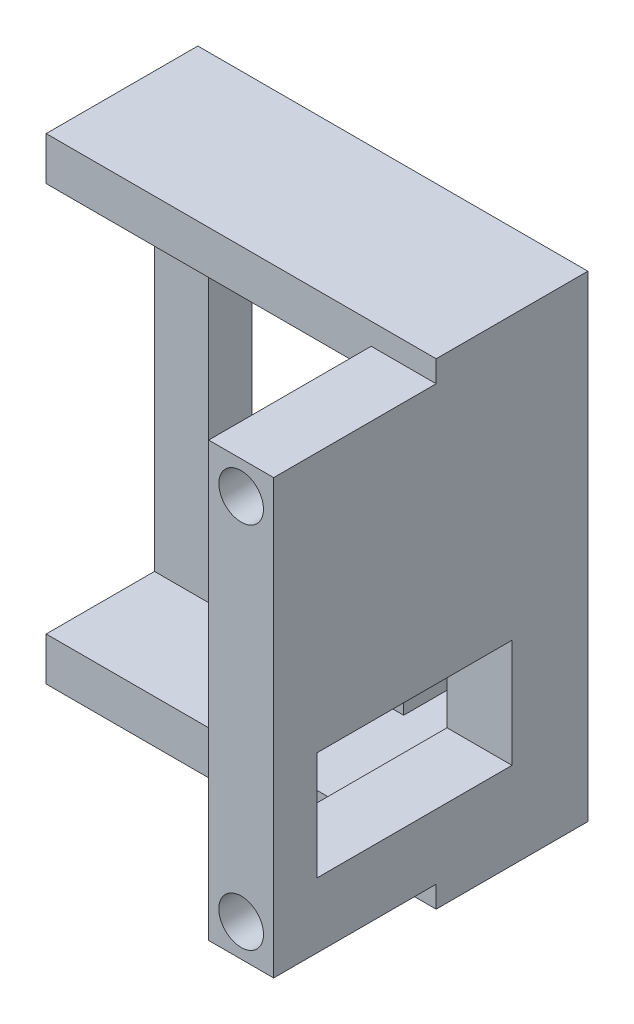
ISO-10303-21;
HEADER;
FILE_DESCRIPTION(('STEP AP214'),'2;1');
FILE_NAME('part.step','',(''),(''),'','','');
FILE_SCHEMA(('AUTOMOTIVE_DESIGN { 1 0 10303 214 1 1 1 1 }'));
ENDSEC;
DATA;
#1=APPLICATION_CONTEXT('core data for automotive mechanical design processes');
#2=APPLICATION_PROTOCOL_DEFINITION('international standard','automotive_design',2000,#1);
#3=PRODUCT_CONTEXT('',#1,'mechanical');
#4=PRODUCT('Part','Part','',(#3));
#5=PRODUCT_RELATED_PRODUCT_CATEGORY('part','',(#4));
#6=PRODUCT_DEFINITION_FORMATION('','',#4);
#7=PRODUCT_DEFINITION_CONTEXT('part definition',#1,'design');
#8=PRODUCT_DEFINITION('design','',#6,#7);
#9=PRODUCT_DEFINITION_SHAPE('','',#8);
#10=(LENGTH_UNIT() NAMED_UNIT(*) SI_UNIT(.MILLI.,.METRE.));
#11=(NAMED_UNIT(*) PLANE_ANGLE_UNIT() SI_UNIT($,.RADIAN.));
#12=(NAMED_UNIT(*) SI_UNIT($,.STERADIAN.) SOLID_ANGLE_UNIT());
#13=UNCERTAINTY_MEASURE_WITH_UNIT(LENGTH_MEASURE(1.E-05),#10,'distance_accuracy_value','');
#14=(GEOMETRIC_REPRESENTATION_CONTEXT(3) GLOBAL_UNCERTAINTY_ASSIGNED_CONTEXT((#13)) GLOBAL_UNIT_ASSIGNED_CONTEXT((#10,
#11,#12)) REPRESENTATION_CONTEXT('',''));
#15=CARTESIAN_POINT('',(0.,0.,0.));
#16=DIRECTION('',(0.,0.,1.));
#17=DIRECTION('',(1.,0.,0.));
#18=AXIS2_PLACEMENT_3D('',#15,#16,#17);
#19=CARTESIAN_POINT('',(-2.325,-15.4875,25.));
#20=DIRECTION('',(0.,1.,0.));
#21=DIRECTION('',(-1.,0.,0.));
#22=AXIS2_PLACEMENT_3D('',#19,#20,#21);
#23=PLANE('',#22);
#24=DIRECTION('',(-1.,0.,0.));
#25=VECTOR('',#24,1.);
#26=CARTESIAN_POINT('',(0.,-15.4875,10.));
#27=LINE('',#26,#25);
#28=CARTESIAN_POINT('',(3.675,-15.4875,10.));
#29=VERTEX_POINT('',#28);
#30=CARTESIAN_POINT('',(-2.325,-15.4875,10.));
#31=VERTEX_POINT('',#30);
#32=EDGE_CURVE('E314',#29,#31,#27,.T.);
#33=ORIENTED_EDGE('',*,*,#32,.F.);
#34=DIRECTION('',(0.,0.,-1.));
#35=VECTOR('',#34,1.);
#36=CARTESIAN_POINT('',(3.675,-15.4875,25.));
#37=LINE('',#36,#35);
#38=CARTESIAN_POINT('',(3.675,-15.4875,25.));
#39=VERTEX_POINT('',#38);
#40=EDGE_CURVE('E390',#39,#29,#37,.T.);
#41=ORIENTED_EDGE('',*,*,#40,.F.);
#42=DIRECTION('',(1.,0.,0.));
#43=VECTOR('',#42,1.);
#44=CARTESIAN_POINT('',(-2.325,-15.4875,25.));
#45=LINE('',#44,#43);
#46=CARTESIAN_POINT('',(-2.325,-15.4875,25.));
#47=VERTEX_POINT('',#46);
#48=EDGE_CURVE('E371',#47,#39,#45,.T.);
#49=ORIENTED_EDGE('',*,*,#48,.F.);
#50=DIRECTION('',(0.,0.,-1.));
#51=VECTOR('',#50,1.);
#52=CARTESIAN_POINT('',(-2.325,-15.4875,25.));
#53=LINE('',#52,#51);
#54=EDGE_CURVE('E382',#47,#31,#53,.T.);
#55=ORIENTED_EDGE('',*,*,#54,.T.);
#56=EDGE_LOOP('',(#33,#41,#49,#55));
#57=FACE_BOUND('',#56,.T.);
#58=ADVANCED_FACE('F67',(#57),#23,.F.);
#59=CARTESIAN_POINT('',(-2.325,24.5125,25.));
#60=DIRECTION('',(0.,-1.,0.));
#61=DIRECTION('',(0.,0.,-1.));
#62=AXIS2_PLACEMENT_3D('',#59,#60,#61);
#63=PLANE('',#62);
#64=DIRECTION('',(1.,0.,0.));
#65=VECTOR('',#64,1.);
#66=CARTESIAN_POINT('',(0.,24.5125,10.));
#67=LINE('',#66,#65);
#68=CARTESIAN_POINT('',(-2.325,24.5125,10.));
#69=VERTEX_POINT('',#68);
#70=CARTESIAN_POINT('',(3.675,24.5125,10.));
#71=VERTEX_POINT('',#70);
#72=EDGE_CURVE('E350',#69,#71,#67,.T.);
#73=ORIENTED_EDGE('',*,*,#72,.F.);
#74=DIRECTION('',(0.,0.,-1.));
#75=VECTOR('',#74,1.);
#76=CARTESIAN_POINT('',(-2.325,24.5125,25.));
#77=LINE('',#76,#75);
#78=CARTESIAN_POINT('',(-2.325,24.5125,25.));
#79=VERTEX_POINT('',#78);
#80=EDGE_CURVE('E385',#79,#69,#77,.T.);
#81=ORIENTED_EDGE('',*,*,#80,.F.);
#82=DIRECTION('',(-1.,0.,0.));
#83=VECTOR('',#82,1.);
#84=CARTESIAN_POINT('',(-2.325,24.5125,25.));
#85=LINE('',#84,#83);
#86=CARTESIAN_POINT('',(3.675,24.5125,25.));
#87=VERTEX_POINT('',#86);
#88=EDGE_CURVE('E378',#87,#79,#85,.T.);
#89=ORIENTED_EDGE('',*,*,#88,.F.);
#90=DIRECTION('',(0.,0.,-1.));
#91=VECTOR('',#90,1.);
#92=CARTESIAN_POINT('',(3.675,24.5125,25.));
#93=LINE('',#92,#91);
#94=EDGE_CURVE('E388',#87,#71,#93,.T.);
#95=ORIENTED_EDGE('',*,*,#94,.T.);
#96=EDGE_LOOP('',(#73,#81,#89,#95));
#97=FACE_BOUND('',#96,.T.);
#98=ADVANCED_FACE('F418',(#97),#63,.F.);
#99=CARTESIAN_POINT('',(-2.325,-15.4875,25.));
#100=DIRECTION('',(1.,0.,0.));
#101=DIRECTION('',(0.,0.,-1.));
#102=AXIS2_PLACEMENT_3D('',#99,#100,#101);
#103=PLANE('',#102);
#104=DIRECTION('',(0.,-1.,0.));
#105=VECTOR('',#104,1.);
#106=CARTESIAN_POINT('',(-2.325,0.512499999999987,3.));
#107=LINE('',#106,#105);
#108=CARTESIAN_POINT('',(-2.325,0.512499999999987,3.));
#109=VERTEX_POINT('',#108);
#110=CARTESIAN_POINT('',(-2.325,-9.48750000000001,3.));
#111=VERTEX_POINT('',#110);
#112=EDGE_CURVE('E227',#109,#111,#107,.T.);
#113=ORIENTED_EDGE('',*,*,#112,.F.);
#114=DIRECTION('',(0.,0.,-1.));
#115=VECTOR('',#114,1.);
#116=CARTESIAN_POINT('',(-2.325,0.512499999999989,21.));
#117=LINE('',#116,#115);
#118=CARTESIAN_POINT('',(-2.325,0.512499999999989,21.));
#119=VERTEX_POINT('',#118);
#120=EDGE_CURVE('E81',#119,#109,#117,.T.);
#121=ORIENTED_EDGE('',*,*,#120,.F.);
#122=DIRECTION('',(0.,1.,0.));
#123=VECTOR('',#122,1.);
#124=CARTESIAN_POINT('',(-2.325,0.512499999999989,21.));
#125=LINE('',#124,#123);
#126=CARTESIAN_POINT('',(-2.325,-9.48750000000001,21.));
#127=VERTEX_POINT('',#126);
#128=EDGE_CURVE('E234',#127,#119,#125,.T.);
#129=ORIENTED_EDGE('',*,*,#128,.F.);
#130=DIRECTION('',(0.,0.,1.));
#131=VECTOR('',#130,1.);
#132=CARTESIAN_POINT('',(-2.325,-9.48750000000001,21.));
#133=LINE('',#132,#131);
#134=EDGE_CURVE('E218',#111,#127,#133,.T.);
#135=ORIENTED_EDGE('',*,*,#134,.F.);
#136=EDGE_LOOP('',(#113,#121,#129,#135));
#137=FACE_BOUND('',#136,.T.);
#138=DIRECTION('',(0.,0.,-1.));
#139=VECTOR('',#138,1.);
#140=CARTESIAN_POINT('',(-2.325,-13.4875,10.));
#141=LINE('',#140,#139);
#142=CARTESIAN_POINT('',(-2.325,-13.4875,10.));
#143=VERTEX_POINT('',#142);
#144=CARTESIAN_POINT('',(-2.325,-13.4875,-4.));
#145=VERTEX_POINT('',#144);
#146=EDGE_CURVE('E332',#143,#145,#141,.T.);
#147=ORIENTED_EDGE('',*,*,#146,.F.);
#148=DIRECTION('',(0.,1.,0.));
#149=VECTOR('',#148,1.);
#150=CARTESIAN_POINT('',(-2.325,0.,10.));
#151=LINE('',#150,#149);
#152=EDGE_CURVE('E311',#31,#143,#151,.T.);
#153=ORIENTED_EDGE('',*,*,#152,.F.);
#154=ORIENTED_EDGE('',*,*,#54,.F.);
#155=DIRECTION('',(0.,-1.,0.));
#156=VECTOR('',#155,1.);
#157=CARTESIAN_POINT('',(-2.325,-15.4875,25.));
#158=LINE('',#157,#156);
#159=EDGE_CURVE('E380',#79,#47,#158,.T.);
#160=ORIENTED_EDGE('',*,*,#159,.F.);
#161=ORIENTED_EDGE('',*,*,#80,.T.);
#162=DIRECTION('',(0.,1.,0.));
#163=VECTOR('',#162,1.);
#164=CARTESIAN_POINT('',(-2.325,0.,10.));
#165=LINE('',#164,#163);
#166=CARTESIAN_POINT('',(-2.325,22.5125,10.));
#167=VERTEX_POINT('',#166);
#168=EDGE_CURVE('E336',#167,#69,#165,.T.);
#169=ORIENTED_EDGE('',*,*,#168,.F.);
#170=DIRECTION('',(0.,0.,-1.));
#171=VECTOR('',#170,1.);
#172=CARTESIAN_POINT('',(-2.325,22.5125,10.));
#173=LINE('',#172,#171);
#174=CARTESIAN_POINT('',(-2.325,22.5125,-4.));
#175=VERTEX_POINT('',#174);
#176=EDGE_CURVE('E353',#167,#175,#173,.T.);
#177=ORIENTED_EDGE('',*,*,#176,.T.);
#178=DIRECTION('',(0.,1.,0.));
#179=VECTOR('',#178,1.);
#180=CARTESIAN_POINT('',(-2.325,0.,-4.));
#181=LINE('',#180,#179);
#182=EDGE_CURVE('E261',#145,#175,#181,.T.);
#183=ORIENTED_EDGE('',*,*,#182,.F.);
#184=EDGE_LOOP('',(#147,#153,#154,#160,#161,#169,#177,#183));
#185=FACE_BOUND('',#184,.T.);
#186=ADVANCED_FACE('F231',(#137,#185),#103,.F.);
#187=CARTESIAN_POINT('',(0.,0.,25.));
#188=DIRECTION('',(0.,0.,1.));
#189=DIRECTION('',(1.,0.,0.));
#190=AXIS2_PLACEMENT_3D('',#187,#188,#189);
#191=PLANE('',#190);
#192=CARTESIAN_POINT('',(0.675000000000003,-12.4875,25.));
#193=DIRECTION('',(0.,0.,1.));
#194=DIRECTION('',(1.,0.,0.));
#195=AXIS2_PLACEMENT_3D('',#192,#193,#194);
#196=CIRCLE('',#195,2.06);
#197=CARTESIAN_POINT('',(2.735,-12.4875,25.));
#198=VERTEX_POINT('',#197);
#199=EDGE_CURVE('E368',#198,#198,#196,.T.);
#200=ORIENTED_EDGE('',*,*,#199,.F.);
#201=EDGE_LOOP('',(#200));
#202=FACE_BOUND('',#201,.T.);
#203=ORIENTED_EDGE('',*,*,#48,.T.);
#204=DIRECTION('',(0.,1.,0.));
#205=VECTOR('',#204,1.);
#206=CARTESIAN_POINT('',(3.675,-15.4875,25.));
#207=LINE('',#206,#205);
#208=EDGE_CURVE('E376',#39,#87,#207,.T.);
#209=ORIENTED_EDGE('',*,*,#208,.T.);
#210=ORIENTED_EDGE('',*,*,#88,.T.);
#211=ORIENTED_EDGE('',*,*,#159,.T.);
#212=EDGE_LOOP('',(#203,#209,#210,#211));
#213=FACE_BOUND('',#212,.T.);
#214=CARTESIAN_POINT('',(0.675000000000012,21.5125,25.));
#215=DIRECTION('',(0.,0.,1.));
#216=DIRECTION('',(-1.,0.,0.));
#217=AXIS2_PLACEMENT_3D('',#214,#215,#216);
#218=CIRCLE('',#217,2.06);
#219=CARTESIAN_POINT('',(-1.38499999999998,21.5125,25.));
#220=VERTEX_POINT('',#219);
#221=EDGE_CURVE('E362',#220,#220,#218,.T.);
#222=ORIENTED_EDGE('',*,*,#221,.F.);
#223=EDGE_LOOP('',(#222));
#224=FACE_BOUND('',#223,.T.);
#225=ADVANCED_FACE('F460',(#202,#213,#224),#191,.T.);
#226=CARTESIAN_POINT('',(3.675,-15.4875,25.));
#227=DIRECTION('',(-1.,0.,0.));
#228=DIRECTION('',(0.,0.,1.));
#229=AXIS2_PLACEMENT_3D('',#226,#227,#228);
#230=PLANE('',#229);
#231=DIRECTION('',(0.,1.,0.));
#232=VECTOR('',#231,1.);
#233=CARTESIAN_POINT('',(3.675,-15.4875,21.));
#234=LINE('',#233,#232);
#235=CARTESIAN_POINT('',(3.675,-9.48750000000001,21.));
#236=VERTEX_POINT('',#235);
#237=CARTESIAN_POINT('',(3.675,0.512499999999989,21.));
#238=VERTEX_POINT('',#237);
#239=EDGE_CURVE('E74',#236,#238,#234,.T.);
#240=ORIENTED_EDGE('',*,*,#239,.T.);
#241=DIRECTION('',(0.,0.,-1.));
#242=VECTOR('',#241,1.);
#243=CARTESIAN_POINT('',(3.675,0.512499999999989,25.));
#244=LINE('',#243,#242);
#245=CARTESIAN_POINT('',(3.675,0.512499999999987,3.));
#246=VERTEX_POINT('',#245);
#247=EDGE_CURVE('E12',#238,#246,#244,.T.);
#248=ORIENTED_EDGE('',*,*,#247,.T.);
#249=DIRECTION('',(0.,-1.,0.));
#250=VECTOR('',#249,1.);
#251=CARTESIAN_POINT('',(3.675,-15.4875,3.));
#252=LINE('',#251,#250);
#253=CARTESIAN_POINT('',(3.675,-9.48750000000001,3.));
#254=VERTEX_POINT('',#253);
#255=EDGE_CURVE('E393',#246,#254,#252,.T.);
#256=ORIENTED_EDGE('',*,*,#255,.T.);
#257=DIRECTION('',(0.,0.,1.));
#258=VECTOR('',#257,1.);
#259=CARTESIAN_POINT('',(3.675,-9.48750000000001,25.));
#260=LINE('',#259,#258);
#261=EDGE_CURVE('E221',#254,#236,#260,.T.);
#262=ORIENTED_EDGE('',*,*,#261,.T.);
#263=EDGE_LOOP('',(#240,#248,#256,#262));
#264=FACE_BOUND('',#263,.T.);
#265=DIRECTION('',(0.,0.,-1.));
#266=VECTOR('',#265,1.);
#267=CARTESIAN_POINT('',(3.675,-17.4875,10.));
#268=LINE('',#267,#266);
#269=CARTESIAN_POINT('',(3.675,-17.4875,10.));
#270=VERTEX_POINT('',#269);
#271=CARTESIAN_POINT('',(3.675,-17.4875,-4.));
#272=VERTEX_POINT('',#271);
#273=EDGE_CURVE('E330',#270,#272,#268,.T.);
#274=ORIENTED_EDGE('',*,*,#273,.T.);
#275=DIRECTION('',(0.,-1.,0.));
#276=VECTOR('',#275,1.);
#277=CARTESIAN_POINT('',(3.675,0.,-4.));
#278=LINE('',#277,#276);
#279=CARTESIAN_POINT('',(3.675,26.5125,-4.));
#280=VERTEX_POINT('',#279);
#281=EDGE_CURVE('E251',#280,#272,#278,.T.);
#282=ORIENTED_EDGE('',*,*,#281,.F.);
#283=DIRECTION('',(0.,0.,-1.));
#284=VECTOR('',#283,1.);
#285=CARTESIAN_POINT('',(3.675,26.5125,10.));
#286=LINE('',#285,#284);
#287=CARTESIAN_POINT('',(3.675,26.5125,10.));
#288=VERTEX_POINT('',#287);
#289=EDGE_CURVE('E326',#288,#280,#286,.T.);
#290=ORIENTED_EDGE('',*,*,#289,.F.);
#291=DIRECTION('',(0.,1.,0.));
#292=VECTOR('',#291,1.);
#293=CARTESIAN_POINT('',(3.67500000000001,0.,10.));
#294=LINE('',#293,#292);
#295=EDGE_CURVE('E348',#71,#288,#294,.T.);
#296=ORIENTED_EDGE('',*,*,#295,.F.);
#297=ORIENTED_EDGE('',*,*,#94,.F.);
#298=ORIENTED_EDGE('',*,*,#208,.F.);
#299=ORIENTED_EDGE('',*,*,#40,.T.);
#300=DIRECTION('',(0.,-1.,0.));
#301=VECTOR('',#300,1.);
#302=CARTESIAN_POINT('',(3.67500000000001,0.,10.));
#303=LINE('',#302,#301);
#304=EDGE_CURVE('E317',#29,#270,#303,.T.);
#305=ORIENTED_EDGE('',*,*,#304,.T.);
#306=EDGE_LOOP('',(#274,#282,#290,#296,#297,#298,#299,#305));
#307=FACE_BOUND('',#306,.T.);
#308=ADVANCED_FACE('F397',(#264,#307),#230,.F.);
#309=CARTESIAN_POINT('',(0.675000000000003,-12.4875,25.));
#310=DIRECTION('',(0.,0.,-1.));
#311=DIRECTION('',(-1.,0.,0.));
#312=AXIS2_PLACEMENT_3D('',#309,#310,#311);
#313=CYLINDRICAL_SURFACE('',#312,2.06);
#314=ORIENTED_EDGE('',*,*,#199,.T.);
#315=EDGE_LOOP('',(#314));
#316=FACE_BOUND('',#315,.T.);
#317=CARTESIAN_POINT('',(0.675000000000003,-12.4875,0.));
#318=DIRECTION('',(0.,0.,1.));
#319=DIRECTION('',(1.,0.,0.));
#320=AXIS2_PLACEMENT_3D('',#317,#318,#319);
#321=CIRCLE('',#320,2.06);
#322=CARTESIAN_POINT('',(2.735,-12.4875,0.));
#323=VERTEX_POINT('',#322);
#324=EDGE_CURVE('E365',#323,#323,#321,.T.);
#325=ORIENTED_EDGE('',*,*,#324,.F.);
#326=EDGE_LOOP('',(#325));
#327=FACE_BOUND('',#326,.T.);
#328=ADVANCED_FACE('F469',(#316,#327),#313,.F.);
#329=CARTESIAN_POINT('',(0.675000000000012,21.5125,25.));
#330=DIRECTION('',(0.,0.,-1.));
#331=DIRECTION('',(-1.,0.,0.));
#332=AXIS2_PLACEMENT_3D('',#329,#330,#331);
#333=CYLINDRICAL_SURFACE('',#332,2.06);
#334=ORIENTED_EDGE('',*,*,#221,.T.);
#335=EDGE_LOOP('',(#334));
#336=FACE_BOUND('',#335,.T.);
#337=CARTESIAN_POINT('',(0.675000000000012,21.5125,0.));
#338=DIRECTION('',(0.,0.,1.));
#339=DIRECTION('',(-1.,0.,0.));
#340=AXIS2_PLACEMENT_3D('',#337,#338,#339);
#341=CIRCLE('',#340,2.06);
#342=CARTESIAN_POINT('',(-1.38499999999998,21.5125,0.));
#343=VERTEX_POINT('',#342);
#344=EDGE_CURVE('E329',#343,#343,#341,.T.);
#345=ORIENTED_EDGE('',*,*,#344,.F.);
#346=EDGE_LOOP('',(#345));
#347=FACE_BOUND('',#346,.T.);
#348=ADVANCED_FACE('F467',(#336,#347),#333,.F.);
#349=CARTESIAN_POINT('',(0.,26.5125,10.));
#350=DIRECTION('',(0.,-1.,0.));
#351=DIRECTION('',(1.,0.,0.));
#352=AXIS2_PLACEMENT_3D('',#349,#350,#351);
#353=PLANE('',#352);
#354=ORIENTED_EDGE('',*,*,#289,.T.);
#355=DIRECTION('',(1.,0.,0.));
#356=VECTOR('',#355,1.);
#357=CARTESIAN_POINT('',(0.,26.5125,-4.));
#358=LINE('',#357,#356);
#359=CARTESIAN_POINT('',(-32.325,26.5125,-4.));
#360=VERTEX_POINT('',#359);
#361=EDGE_CURVE('E247',#360,#280,#358,.T.);
#362=ORIENTED_EDGE('',*,*,#361,.F.);
#363=DIRECTION('',(0.,0.,-1.));
#364=VECTOR('',#363,1.);
#365=CARTESIAN_POINT('',(-32.325,26.5125,10.));
#366=LINE('',#365,#364);
#367=CARTESIAN_POINT('',(-32.325,26.5125,10.));
#368=VERTEX_POINT('',#367);
#369=EDGE_CURVE('E357',#368,#360,#366,.T.);
#370=ORIENTED_EDGE('',*,*,#369,.F.);
#371=DIRECTION('',(-1.,0.,0.));
#372=VECTOR('',#371,1.);
#373=CARTESIAN_POINT('',(0.,26.5125,10.));
#374=LINE('',#373,#372);
#375=EDGE_CURVE('E346',#288,#368,#374,.T.);
#376=ORIENTED_EDGE('',*,*,#375,.F.);
#377=EDGE_LOOP('',(#354,#362,#370,#376));
#378=FACE_BOUND('',#377,.T.);
#379=ADVANCED_FACE('F448',(#378),#353,.F.);
#380=CARTESIAN_POINT('',(0.,22.5125,10.));
#381=DIRECTION('',(0.,-1.,0.));
#382=DIRECTION('',(1.,0.,0.));
#383=AXIS2_PLACEMENT_3D('',#380,#381,#382);
#384=PLANE('',#383);
#385=DIRECTION('',(-1.,0.,0.));
#386=VECTOR('',#385,1.);
#387=CARTESIAN_POINT('',(0.,22.5125,0.));
#388=LINE('',#387,#386);
#389=CARTESIAN_POINT('',(-9.32499999999999,22.5125,0.));
#390=VERTEX_POINT('',#389);
#391=CARTESIAN_POINT('',(-14.325,22.5125,0.));
#392=VERTEX_POINT('',#391);
#393=EDGE_CURVE('E340',#390,#392,#388,.T.);
#394=ORIENTED_EDGE('',*,*,#393,.F.);
#395=DIRECTION('',(0.,0.,1.));
#396=VECTOR('',#395,1.);
#397=CARTESIAN_POINT('',(-9.32499999999999,22.5125,-4.));
#398=LINE('',#397,#396);
#399=CARTESIAN_POINT('',(-9.32499999999999,22.5125,-4.));
#400=VERTEX_POINT('',#399);
#401=EDGE_CURVE('E283',#400,#390,#398,.T.);
#402=ORIENTED_EDGE('',*,*,#401,.F.);
#403=DIRECTION('',(1.,0.,0.));
#404=VECTOR('',#403,1.);
#405=CARTESIAN_POINT('',(0.,22.5125,-4.));
#406=LINE('',#405,#404);
#407=EDGE_CURVE('E264',#400,#175,#406,.T.);
#408=ORIENTED_EDGE('',*,*,#407,.T.);
#409=ORIENTED_EDGE('',*,*,#176,.F.);
#410=DIRECTION('',(-1.,0.,0.));
#411=VECTOR('',#410,1.);
#412=CARTESIAN_POINT('',(0.,22.5125,10.));
#413=LINE('',#412,#411);
#414=CARTESIAN_POINT('',(-32.325,22.5125,10.));
#415=VERTEX_POINT('',#414);
#416=EDGE_CURVE('E339',#167,#415,#413,.T.);
#417=ORIENTED_EDGE('',*,*,#416,.T.);
#418=DIRECTION('',(0.,0.,-1.));
#419=VECTOR('',#418,1.);
#420=CARTESIAN_POINT('',(-32.325,22.5125,10.));
#421=LINE('',#420,#419);
#422=CARTESIAN_POINT('',(-32.325,22.5125,0.));
#423=VERTEX_POINT('',#422);
#424=EDGE_CURVE('E359',#415,#423,#421,.T.);
#425=ORIENTED_EDGE('',*,*,#424,.T.);
#426=CARTESIAN_POINT('',(-27.325,22.5125,0.));
#427=VERTEX_POINT('',#426);
#428=EDGE_CURVE('E295',#427,#423,#388,.T.);
#429=ORIENTED_EDGE('',*,*,#428,.F.);
#430=DIRECTION('',(0.,0.,1.));
#431=VECTOR('',#430,1.);
#432=CARTESIAN_POINT('',(-27.325,22.5125,-4.));
#433=LINE('',#432,#431);
#434=CARTESIAN_POINT('',(-27.325,22.5125,-4.));
#435=VERTEX_POINT('',#434);
#436=EDGE_CURVE('E280',#435,#427,#433,.T.);
#437=ORIENTED_EDGE('',*,*,#436,.F.);
#438=CARTESIAN_POINT('',(-14.325,22.5125,-4.));
#439=VERTEX_POINT('',#438);
#440=EDGE_CURVE('E265',#435,#439,#406,.T.);
#441=ORIENTED_EDGE('',*,*,#440,.T.);
#442=DIRECTION('',(0.,0.,1.));
#443=VECTOR('',#442,1.);
#444=CARTESIAN_POINT('',(-14.325,22.5125,-4.));
#445=LINE('',#444,#443);
#446=EDGE_CURVE('E286',#439,#392,#445,.T.);
#447=ORIENTED_EDGE('',*,*,#446,.T.);
#448=EDGE_LOOP('',(#394,#402,#408,#409,#417,#425,#429,#437,#441,#447));
#449=FACE_BOUND('',#448,.T.);
#450=ADVANCED_FACE('F510',(#449),#384,.T.);
#451=CARTESIAN_POINT('',(0.,0.,10.));
#452=DIRECTION('',(0.,0.,-1.));
#453=DIRECTION('',(-1.,0.,0.));
#454=AXIS2_PLACEMENT_3D('',#451,#452,#453);
#455=PLANE('',#454);
#456=ORIENTED_EDGE('',*,*,#168,.T.);
#457=ORIENTED_EDGE('',*,*,#72,.T.);
#458=ORIENTED_EDGE('',*,*,#295,.T.);
#459=ORIENTED_EDGE('',*,*,#375,.T.);
#460=DIRECTION('',(0.,1.,0.));
#461=VECTOR('',#460,1.);
#462=CARTESIAN_POINT('',(-32.325,0.,10.));
#463=LINE('',#462,#461);
#464=EDGE_CURVE('E343',#415,#368,#463,.T.);
#465=ORIENTED_EDGE('',*,*,#464,.F.);
#466=ORIENTED_EDGE('',*,*,#416,.F.);
#467=EDGE_LOOP('',(#456,#457,#458,#459,#465,#466));
#468=FACE_BOUND('',#467,.T.);
#469=ADVANCED_FACE('F453',(#468),#455,.F.);
#470=CARTESIAN_POINT('',(-32.325,0.,10.));
#471=DIRECTION('',(1.,0.,0.));
#472=DIRECTION('',(0.,0.,-1.));
#473=AXIS2_PLACEMENT_3D('',#470,#471,#472);
#474=PLANE('',#473);
#475=DIRECTION('',(0.,0.,-1.));
#476=VECTOR('',#475,1.);
#477=CARTESIAN_POINT('',(-32.325,-13.4875,10.));
#478=LINE('',#477,#476);
#479=CARTESIAN_POINT('',(-32.325,-13.4875,10.));
#480=VERTEX_POINT('',#479);
#481=CARTESIAN_POINT('',(-32.325,-13.4875,0.));
#482=VERTEX_POINT('',#481);
#483=EDGE_CURVE('E323',#480,#482,#478,.T.);
#484=ORIENTED_EDGE('',*,*,#483,.T.);
#485=DIRECTION('',(0.,1.,0.));
#486=VECTOR('',#485,1.);
#487=CARTESIAN_POINT('',(-32.325,0.,0.));
#488=LINE('',#487,#486);
#489=EDGE_CURVE('E272',#482,#423,#488,.T.);
#490=ORIENTED_EDGE('',*,*,#489,.T.);
#491=ORIENTED_EDGE('',*,*,#424,.F.);
#492=ORIENTED_EDGE('',*,*,#464,.T.);
#493=ORIENTED_EDGE('',*,*,#369,.T.);
#494=DIRECTION('',(0.,1.,0.));
#495=VECTOR('',#494,1.);
#496=CARTESIAN_POINT('',(-32.325,0.,-4.));
#497=LINE('',#496,#495);
#498=CARTESIAN_POINT('',(-32.325,-17.4875,-4.));
#499=VERTEX_POINT('',#498);
#500=EDGE_CURVE('E244',#499,#360,#497,.T.);
#501=ORIENTED_EDGE('',*,*,#500,.F.);
#502=DIRECTION('',(0.,0.,-1.));
#503=VECTOR('',#502,1.);
#504=CARTESIAN_POINT('',(-32.325,-17.4875,10.));
#505=LINE('',#504,#503);
#506=CARTESIAN_POINT('',(-32.325,-17.4875,10.));
#507=VERTEX_POINT('',#506);
#508=EDGE_CURVE('E327',#507,#499,#505,.T.);
#509=ORIENTED_EDGE('',*,*,#508,.F.);
#510=DIRECTION('',(0.,-1.,0.));
#511=VECTOR('',#510,1.);
#512=CARTESIAN_POINT('',(-32.325,0.,10.));
#513=LINE('',#512,#511);
#514=EDGE_CURVE('E306',#480,#507,#513,.T.);
#515=ORIENTED_EDGE('',*,*,#514,.F.);
#516=EDGE_LOOP('',(#484,#490,#491,#492,#493,#501,#509,#515));
#517=FACE_BOUND('',#516,.T.);
#518=ADVANCED_FACE('F521',(#517),#474,.F.);
#519=CARTESIAN_POINT('',(0.,-17.4875,10.));
#520=DIRECTION('',(0.,-1.,0.));
#521=DIRECTION('',(1.,0.,0.));
#522=AXIS2_PLACEMENT_3D('',#519,#520,#521);
#523=PLANE('',#522);
#524=ORIENTED_EDGE('',*,*,#508,.T.);
#525=DIRECTION('',(-1.,0.,0.));
#526=VECTOR('',#525,1.);
#527=CARTESIAN_POINT('',(0.,-17.4875,-4.));
#528=LINE('',#527,#526);
#529=EDGE_CURVE('E254',#272,#499,#528,.T.);
#530=ORIENTED_EDGE('',*,*,#529,.F.);
#531=ORIENTED_EDGE('',*,*,#273,.F.);
#532=DIRECTION('',(-1.,0.,0.));
#533=VECTOR('',#532,1.);
#534=CARTESIAN_POINT('',(0.,-17.4875,10.));
#535=LINE('',#534,#533);
#536=EDGE_CURVE('E320',#270,#507,#535,.T.);
#537=ORIENTED_EDGE('',*,*,#536,.T.);
#538=EDGE_LOOP('',(#524,#530,#531,#537));
#539=FACE_BOUND('',#538,.T.);
#540=ADVANCED_FACE('F437',(#539),#523,.T.);
#541=CARTESIAN_POINT('',(0.,-13.4875,10.));
#542=DIRECTION('',(0.,-1.,0.));
#543=DIRECTION('',(1.,0.,0.));
#544=AXIS2_PLACEMENT_3D('',#541,#542,#543);
#545=PLANE('',#544);
#546=ORIENTED_EDGE('',*,*,#146,.T.);
#547=DIRECTION('',(1.,0.,0.));
#548=VECTOR('',#547,1.);
#549=CARTESIAN_POINT('',(0.,-13.4875,-4.));
#550=LINE('',#549,#548);
#551=CARTESIAN_POINT('',(-9.32499999999999,-13.4875,-4.));
#552=VERTEX_POINT('',#551);
#553=EDGE_CURVE('E257',#552,#145,#550,.T.);
#554=ORIENTED_EDGE('',*,*,#553,.F.);
#555=DIRECTION('',(0.,0.,1.));
#556=VECTOR('',#555,1.);
#557=CARTESIAN_POINT('',(-9.32499999999999,-13.4875,-4.));
#558=LINE('',#557,#556);
#559=CARTESIAN_POINT('',(-9.32499999999999,-13.4875,0.));
#560=VERTEX_POINT('',#559);
#561=EDGE_CURVE('E289',#552,#560,#558,.T.);
#562=ORIENTED_EDGE('',*,*,#561,.T.);
#563=DIRECTION('',(-1.,0.,0.));
#564=VECTOR('',#563,1.);
#565=CARTESIAN_POINT('',(0.,-13.4875,0.));
#566=LINE('',#565,#564);
#567=CARTESIAN_POINT('',(-14.325,-13.4875,0.));
#568=VERTEX_POINT('',#567);
#569=EDGE_CURVE('E309',#560,#568,#566,.T.);
#570=ORIENTED_EDGE('',*,*,#569,.T.);
#571=DIRECTION('',(0.,0.,1.));
#572=VECTOR('',#571,1.);
#573=CARTESIAN_POINT('',(-14.325,-13.4875,-4.));
#574=LINE('',#573,#572);
#575=CARTESIAN_POINT('',(-14.325,-13.4875,-4.));
#576=VERTEX_POINT('',#575);
#577=EDGE_CURVE('E292',#576,#568,#574,.T.);
#578=ORIENTED_EDGE('',*,*,#577,.F.);
#579=CARTESIAN_POINT('',(-27.325,-13.4875,-4.));
#580=VERTEX_POINT('',#579);
#581=EDGE_CURVE('E258',#580,#576,#550,.T.);
#582=ORIENTED_EDGE('',*,*,#581,.F.);
#583=DIRECTION('',(0.,0.,1.));
#584=VECTOR('',#583,1.);
#585=CARTESIAN_POINT('',(-27.325,-13.4875,-4.));
#586=LINE('',#585,#584);
#587=CARTESIAN_POINT('',(-27.325,-13.4875,0.));
#588=VERTEX_POINT('',#587);
#589=EDGE_CURVE('E271',#580,#588,#586,.T.);
#590=ORIENTED_EDGE('',*,*,#589,.T.);
#591=EDGE_CURVE('E324',#588,#482,#566,.T.);
#592=ORIENTED_EDGE('',*,*,#591,.T.);
#593=ORIENTED_EDGE('',*,*,#483,.F.);
#594=DIRECTION('',(-1.,0.,0.));
#595=VECTOR('',#594,1.);
#596=CARTESIAN_POINT('',(0.,-13.4875,10.));
#597=LINE('',#596,#595);
#598=EDGE_CURVE('E308',#143,#480,#597,.T.);
#599=ORIENTED_EDGE('',*,*,#598,.F.);
#600=EDGE_LOOP('',(#546,#554,#562,#570,#578,#582,#590,#592,#593,#599));
#601=FACE_BOUND('',#600,.T.);
#602=ADVANCED_FACE('F485',(#601),#545,.F.);
#603=CARTESIAN_POINT('',(0.,0.,10.));
#604=DIRECTION('',(0.,0.,-1.));
#605=DIRECTION('',(-1.,0.,0.));
#606=AXIS2_PLACEMENT_3D('',#603,#604,#605);
#607=PLANE('',#606);
#608=ORIENTED_EDGE('',*,*,#514,.T.);
#609=ORIENTED_EDGE('',*,*,#536,.F.);
#610=ORIENTED_EDGE('',*,*,#304,.F.);
#611=ORIENTED_EDGE('',*,*,#32,.T.);
#612=ORIENTED_EDGE('',*,*,#152,.T.);
#613=ORIENTED_EDGE('',*,*,#598,.T.);
#614=EDGE_LOOP('',(#608,#609,#610,#611,#612,#613));
#615=FACE_BOUND('',#614,.T.);
#616=ADVANCED_FACE('F433',(#615),#607,.F.);
#617=CARTESIAN_POINT('',(0.,0.,0.));
#618=DIRECTION('',(0.,0.,-1.));
#619=DIRECTION('',(-1.,0.,0.));
#620=AXIS2_PLACEMENT_3D('',#617,#618,#619);
#621=PLANE('',#620);
#622=ORIENTED_EDGE('',*,*,#344,.T.);
#623=EDGE_LOOP('',(#622));
#624=FACE_BOUND('',#623,.T.);
#625=ADVANCED_FACE('F473',(#624),#621,.F.);
#626=ORIENTED_EDGE('',*,*,#324,.T.);
#627=EDGE_LOOP('',(#626));
#628=FACE_BOUND('',#627,.T.);
#629=ADVANCED_FACE('F475',(#628),#621,.F.);
#630=ORIENTED_EDGE('',*,*,#569,.F.);
#631=DIRECTION('',(0.,1.,0.));
#632=VECTOR('',#631,1.);
#633=CARTESIAN_POINT('',(-9.32499999999999,-13.4875,0.));
#634=LINE('',#633,#632);
#635=EDGE_CURVE('E241',#560,#390,#634,.T.);
#636=ORIENTED_EDGE('',*,*,#635,.T.);
#637=ORIENTED_EDGE('',*,*,#393,.T.);
#638=DIRECTION('',(0.,1.,0.));
#639=VECTOR('',#638,1.);
#640=CARTESIAN_POINT('',(-14.325,-13.4875,0.));
#641=LINE('',#640,#639);
#642=EDGE_CURVE('E299',#568,#392,#641,.T.);
#643=ORIENTED_EDGE('',*,*,#642,.F.);
#644=EDGE_LOOP('',(#630,#636,#637,#643));
#645=FACE_BOUND('',#644,.T.);
#646=ADVANCED_FACE('F482',(#645),#621,.F.);
#647=CARTESIAN_POINT('',(-27.325,0.,-4.));
#648=DIRECTION('',(1.,0.,0.));
#649=DIRECTION('',(0.,1.,0.));
#650=AXIS2_PLACEMENT_3D('',#647,#648,#649);
#651=PLANE('',#650);
#652=DIRECTION('',(0.,1.,0.));
#653=VECTOR('',#652,1.);
#654=CARTESIAN_POINT('',(-27.325,0.,0.));
#655=LINE('',#654,#653);
#656=EDGE_CURVE('E248',#588,#427,#655,.T.);
#657=ORIENTED_EDGE('',*,*,#656,.F.);
#658=ORIENTED_EDGE('',*,*,#589,.F.);
#659=DIRECTION('',(0.,1.,0.));
#660=VECTOR('',#659,1.);
#661=CARTESIAN_POINT('',(-27.325,0.,-4.));
#662=LINE('',#661,#660);
#663=EDGE_CURVE('E268',#580,#435,#662,.T.);
#664=ORIENTED_EDGE('',*,*,#663,.T.);
#665=ORIENTED_EDGE('',*,*,#436,.T.);
#666=EDGE_LOOP('',(#657,#658,#664,#665));
#667=FACE_BOUND('',#666,.T.);
#668=ADVANCED_FACE('F489',(#667),#651,.T.);
#669=ORIENTED_EDGE('',*,*,#591,.F.);
#670=ORIENTED_EDGE('',*,*,#656,.T.);
#671=ORIENTED_EDGE('',*,*,#428,.T.);
#672=ORIENTED_EDGE('',*,*,#489,.F.);
#673=EDGE_LOOP('',(#669,#670,#671,#672));
#674=FACE_BOUND('',#673,.T.);
#675=ADVANCED_FACE('F477',(#674),#621,.F.);
#676=CARTESIAN_POINT('',(0.,0.,-4.));
#677=DIRECTION('',(0.,0.,-1.));
#678=DIRECTION('',(-1.,0.,0.));
#679=AXIS2_PLACEMENT_3D('',#676,#677,#678);
#680=PLANE('',#679);
#681=DIRECTION('',(0.,1.,0.));
#682=VECTOR('',#681,1.);
#683=CARTESIAN_POINT('',(-9.32499999999999,-13.4875,-4.));
#684=LINE('',#683,#682);
#685=EDGE_CURVE('E296',#552,#400,#684,.T.);
#686=ORIENTED_EDGE('',*,*,#685,.F.);
#687=ORIENTED_EDGE('',*,*,#553,.T.);
#688=ORIENTED_EDGE('',*,*,#182,.T.);
#689=ORIENTED_EDGE('',*,*,#407,.F.);
#690=EDGE_LOOP('',(#686,#687,#688,#689));
#691=FACE_BOUND('',#690,.T.);
#692=ORIENTED_EDGE('',*,*,#500,.T.);
#693=ORIENTED_EDGE('',*,*,#361,.T.);
#694=ORIENTED_EDGE('',*,*,#281,.T.);
#695=ORIENTED_EDGE('',*,*,#529,.T.);
#696=EDGE_LOOP('',(#692,#693,#694,#695));
#697=FACE_BOUND('',#696,.T.);
#698=ORIENTED_EDGE('',*,*,#581,.T.);
#699=DIRECTION('',(0.,1.,0.));
#700=VECTOR('',#699,1.);
#701=CARTESIAN_POINT('',(-14.325,-13.4875,-4.));
#702=LINE('',#701,#700);
#703=EDGE_CURVE('E275',#576,#439,#702,.T.);
#704=ORIENTED_EDGE('',*,*,#703,.T.);
#705=ORIENTED_EDGE('',*,*,#440,.F.);
#706=ORIENTED_EDGE('',*,*,#663,.F.);
#707=EDGE_LOOP('',(#698,#704,#705,#706));
#708=FACE_BOUND('',#707,.T.);
#709=ADVANCED_FACE('F442',(#691,#697,#708),#680,.T.);
#710=CARTESIAN_POINT('',(-14.325,-13.4875,-4.));
#711=DIRECTION('',(1.,0.,0.));
#712=DIRECTION('',(0.,0.,-1.));
#713=AXIS2_PLACEMENT_3D('',#710,#711,#712);
#714=PLANE('',#713);
#715=ORIENTED_EDGE('',*,*,#642,.T.);
#716=ORIENTED_EDGE('',*,*,#446,.F.);
#717=ORIENTED_EDGE('',*,*,#703,.F.);
#718=ORIENTED_EDGE('',*,*,#577,.T.);
#719=EDGE_LOOP('',(#715,#716,#717,#718));
#720=FACE_BOUND('',#719,.T.);
#721=ADVANCED_FACE('F412',(#720),#714,.F.);
#722=CARTESIAN_POINT('',(-9.32499999999999,-13.4875,-4.));
#723=DIRECTION('',(1.,0.,0.));
#724=DIRECTION('',(0.,1.,0.));
#725=AXIS2_PLACEMENT_3D('',#722,#723,#724);
#726=PLANE('',#725);
#727=ORIENTED_EDGE('',*,*,#635,.F.);
#728=ORIENTED_EDGE('',*,*,#561,.F.);
#729=ORIENTED_EDGE('',*,*,#685,.T.);
#730=ORIENTED_EDGE('',*,*,#401,.T.);
#731=EDGE_LOOP('',(#727,#728,#729,#730));
#732=FACE_BOUND('',#731,.T.);
#733=ADVANCED_FACE('F404',(#732),#726,.T.);
#734=CARTESIAN_POINT('',(5.675,0.512499999999989,21.));
#735=DIRECTION('',(0.,1.,0.));
#736=DIRECTION('',(0.,0.,1.));
#737=AXIS2_PLACEMENT_3D('',#734,#735,#736);
#738=PLANE('',#737);
#739=DIRECTION('',(-1.,0.,0.));
#740=VECTOR('',#739,1.);
#741=CARTESIAN_POINT('',(5.675,0.512499999999989,21.));
#742=LINE('',#741,#740);
#743=EDGE_CURVE('E239',#238,#119,#742,.T.);
#744=ORIENTED_EDGE('',*,*,#743,.T.);
#745=ORIENTED_EDGE('',*,*,#120,.T.);
#746=DIRECTION('',(-1.,0.,0.));
#747=VECTOR('',#746,1.);
#748=CARTESIAN_POINT('',(5.675,0.512499999999987,3.));
#749=LINE('',#748,#747);
#750=EDGE_CURVE('E224',#246,#109,#749,.T.);
#751=ORIENTED_EDGE('',*,*,#750,.F.);
#752=ORIENTED_EDGE('',*,*,#247,.F.);
#753=EDGE_LOOP('',(#744,#745,#751,#752));
#754=FACE_BOUND('',#753,.T.);
#755=ADVANCED_FACE('F402',(#754),#738,.F.);
#756=CARTESIAN_POINT('',(5.675,0.512499999999989,21.));
#757=DIRECTION('',(0.,0.,1.));
#758=DIRECTION('',(1.,0.,0.));
#759=AXIS2_PLACEMENT_3D('',#756,#757,#758);
#760=PLANE('',#759);
#761=DIRECTION('',(-1.,0.,0.));
#762=VECTOR('',#761,1.);
#763=CARTESIAN_POINT('',(5.675,-9.48750000000001,21.));
#764=LINE('',#763,#762);
#765=EDGE_CURVE('E223',#236,#127,#764,.T.);
#766=ORIENTED_EDGE('',*,*,#765,.T.);
#767=ORIENTED_EDGE('',*,*,#128,.T.);
#768=ORIENTED_EDGE('',*,*,#743,.F.);
#769=ORIENTED_EDGE('',*,*,#239,.F.);
#770=EDGE_LOOP('',(#766,#767,#768,#769));
#771=FACE_BOUND('',#770,.T.);
#772=ADVANCED_FACE('F401',(#771),#760,.F.);
#773=CARTESIAN_POINT('',(5.675,-9.48750000000001,21.));
#774=DIRECTION('',(0.,-1.,0.));
#775=DIRECTION('',(0.,0.,-1.));
#776=AXIS2_PLACEMENT_3D('',#773,#774,#775);
#777=PLANE('',#776);
#778=DIRECTION('',(-1.,0.,0.));
#779=VECTOR('',#778,1.);
#780=CARTESIAN_POINT('',(5.675,-9.48750000000001,3.));
#781=LINE('',#780,#779);
#782=EDGE_CURVE('E89',#254,#111,#781,.T.);
#783=ORIENTED_EDGE('',*,*,#782,.T.);
#784=ORIENTED_EDGE('',*,*,#134,.T.);
#785=ORIENTED_EDGE('',*,*,#765,.F.);
#786=ORIENTED_EDGE('',*,*,#261,.F.);
#787=EDGE_LOOP('',(#783,#784,#785,#786));
#788=FACE_BOUND('',#787,.T.);
#789=ADVANCED_FACE('F215',(#788),#777,.F.);
#790=CARTESIAN_POINT('',(5.675,0.512499999999987,3.));
#791=DIRECTION('',(0.,0.,-1.));
#792=DIRECTION('',(-1.,0.,0.));
#793=AXIS2_PLACEMENT_3D('',#790,#791,#792);
#794=PLANE('',#793);
#795=ORIENTED_EDGE('',*,*,#750,.T.);
#796=ORIENTED_EDGE('',*,*,#112,.T.);
#797=ORIENTED_EDGE('',*,*,#782,.F.);
#798=ORIENTED_EDGE('',*,*,#255,.F.);
#799=EDGE_LOOP('',(#795,#796,#797,#798));
#800=FACE_BOUND('',#799,.T.);
#801=ADVANCED_FACE('F228',(#800),#794,.F.);
#802=CLOSED_SHELL('',(#58,#98,#186,#225,#308,#328,#348,#379,#450,#469,#518,#540,#602,#616,#625,
#629,#646,#668,#675,#709,#721,#733,#755,#772,#789,#801));
#803=MANIFOLD_SOLID_BREP('B2',#802);
#804=ADVANCED_BREP_SHAPE_REPRESENTATION('',(#18,#803),#14);
#805=SHAPE_DEFINITION_REPRESENTATION(#9,#804);
ENDSEC;
END-ISO-10303-21;
